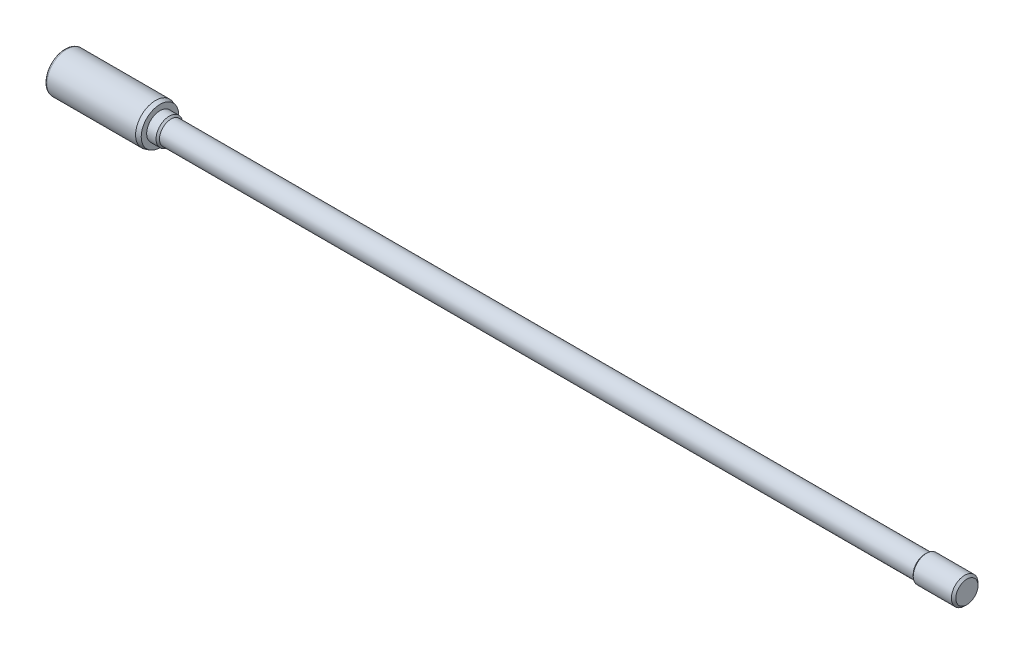
ISO-10303-21;
HEADER;
FILE_DESCRIPTION(('STEP AP214'),'2;1');
FILE_NAME('part.step','',(''),(''),'','','');
FILE_SCHEMA(('AUTOMOTIVE_DESIGN { 1 0 10303 214 1 1 1 1 }'));
ENDSEC;
DATA;
#1=APPLICATION_CONTEXT('core data for automotive mechanical design processes');
#2=APPLICATION_PROTOCOL_DEFINITION('international standard','automotive_design',2000,#1);
#3=PRODUCT_CONTEXT('',#1,'mechanical');
#4=PRODUCT('Part','Part','',(#3));
#5=PRODUCT_RELATED_PRODUCT_CATEGORY('part','',(#4));
#6=PRODUCT_DEFINITION_FORMATION('','',#4);
#7=PRODUCT_DEFINITION_CONTEXT('part definition',#1,'design');
#8=PRODUCT_DEFINITION('design','',#6,#7);
#9=PRODUCT_DEFINITION_SHAPE('','',#8);
#10=(LENGTH_UNIT() NAMED_UNIT(*) SI_UNIT(.MILLI.,.METRE.));
#11=(NAMED_UNIT(*) PLANE_ANGLE_UNIT() SI_UNIT($,.RADIAN.));
#12=(NAMED_UNIT(*) SI_UNIT($,.STERADIAN.) SOLID_ANGLE_UNIT());
#13=UNCERTAINTY_MEASURE_WITH_UNIT(LENGTH_MEASURE(1.E-05),#10,'distance_accuracy_value','');
#14=(GEOMETRIC_REPRESENTATION_CONTEXT(3) GLOBAL_UNCERTAINTY_ASSIGNED_CONTEXT((#13)) GLOBAL_UNIT_ASSIGNED_CONTEXT((#10,
#11,#12)) REPRESENTATION_CONTEXT('',''));
#15=CARTESIAN_POINT('',(0.,0.,0.));
#16=DIRECTION('',(0.,0.,1.));
#17=DIRECTION('',(1.,0.,0.));
#18=AXIS2_PLACEMENT_3D('',#15,#16,#17);
#19=CARTESIAN_POINT('',(4.5,18.5,-18.5));
#20=DIRECTION('',(1.,0.,0.));
#21=DIRECTION('',(0.,0.,-1.));
#22=AXIS2_PLACEMENT_3D('',#19,#20,#21);
#23=PLANE('',#22);
#24=DIRECTION('',(0.,1.,0.));
#25=VECTOR('',#24,1.);
#26=CARTESIAN_POINT('',(4.5,18.5,-21.5));
#27=LINE('',#26,#25);
#28=CARTESIAN_POINT('',(4.5,16.7679491924311,-21.5));
#29=VERTEX_POINT('',#28);
#30=CARTESIAN_POINT('',(4.49999999997521,18.5,-21.5000000000016));
#31=VERTEX_POINT('',#30);
#32=EDGE_CURVE('E83',#29,#31,#27,.T.);
#33=ORIENTED_EDGE('',*,*,#32,.F.);
#34=DIRECTION('',(0.,0.499999999999982,-0.866025403784449));
#35=VECTOR('',#34,1.);
#36=CARTESIAN_POINT('',(4.5,15.9019237886467,-20.));
#37=LINE('',#36,#35);
#38=CARTESIAN_POINT('',(4.49999999997521,15.9019237886453,-20.0000000000008));
#39=VERTEX_POINT('',#38);
#40=EDGE_CURVE('E106',#39,#29,#37,.T.);
#41=ORIENTED_EDGE('',*,*,#40,.F.);
#42=CARTESIAN_POINT('',(4.49999999995043,18.5,-18.5));
#43=DIRECTION('',(-1.,0.,0.));
#44=DIRECTION('',(0.,0.,1.));
#45=AXIS2_PLACEMENT_3D('',#42,#43,#44);
#46=CIRCLE('',#45,3.00000000000319);
#47=EDGE_CURVE('E112',#39,#31,#46,.F.);
#48=ORIENTED_EDGE('',*,*,#47,.T.);
#49=EDGE_LOOP('',(#33,#41,#48));
#50=FACE_BOUND('',#49,.T.);
#51=ADVANCED_FACE('F17',(#50),#23,.F.);
#52=CARTESIAN_POINT('',(4.5,18.5,-18.5));
#53=DIRECTION('',(1.,0.,0.));
#54=DIRECTION('',(0.,0.,-1.));
#55=AXIS2_PLACEMENT_3D('',#52,#53,#54);
#56=PLANE('',#55);
#57=DIRECTION('',(0.,0.499999999999983,0.866025403784448));
#58=VECTOR('',#57,1.);
#59=CARTESIAN_POINT('',(4.5,20.2320508075689,-21.5));
#60=LINE('',#59,#58);
#61=CARTESIAN_POINT('',(4.5,20.2320508075689,-21.5));
#62=VERTEX_POINT('',#61);
#63=CARTESIAN_POINT('',(4.49999999997521,21.0980762113547,-20.0000000000008));
#64=VERTEX_POINT('',#63);
#65=EDGE_CURVE('E120',#62,#64,#60,.T.);
#66=ORIENTED_EDGE('',*,*,#65,.F.);
#67=DIRECTION('',(0.,1.,0.));
#68=VECTOR('',#67,1.);
#69=CARTESIAN_POINT('',(4.5,18.5,-21.5));
#70=LINE('',#69,#68);
#71=EDGE_CURVE('E125',#31,#62,#70,.T.);
#72=ORIENTED_EDGE('',*,*,#71,.F.);
#73=CARTESIAN_POINT('',(4.49999999995043,18.5,-18.5));
#74=DIRECTION('',(-1.,0.,0.));
#75=DIRECTION('',(0.,0.,1.));
#76=AXIS2_PLACEMENT_3D('',#73,#74,#75);
#77=CIRCLE('',#76,3.00000000000319);
#78=EDGE_CURVE('E119',#31,#64,#77,.F.);
#79=ORIENTED_EDGE('',*,*,#78,.T.);
#80=EDGE_LOOP('',(#66,#72,#79));
#81=FACE_BOUND('',#80,.T.);
#82=ADVANCED_FACE('F573',(#81),#56,.F.);
#83=CARTESIAN_POINT('',(15.,19.75,-18.5));
#84=DIRECTION('',(-1.,0.,0.));
#85=DIRECTION('',(0.,0.,1.));
#86=AXIS2_PLACEMENT_3D('',#83,#84,#85);
#87=PLANE('',#86);
#88=CARTESIAN_POINT('',(15.,18.5,-18.5));
#89=DIRECTION('',(1.,0.,0.));
#90=DIRECTION('',(0.,0.,-1.));
#91=AXIS2_PLACEMENT_3D('',#88,#89,#90);
#92=CIRCLE('',#91,2.4585);
#93=CARTESIAN_POINT('',(15.,18.5,-20.9585));
#94=VERTEX_POINT('',#93);
#95=EDGE_CURVE('E257',#94,#94,#92,.F.);
#96=ORIENTED_EDGE('',*,*,#95,.T.);
#97=EDGE_LOOP('',(#96));
#98=FACE_BOUND('',#97,.T.);
#99=ADVANCED_FACE('F305',(#98),#87,.T.);
#100=CARTESIAN_POINT('',(4.5,18.5,-18.5));
#101=DIRECTION('',(1.,0.,0.));
#102=DIRECTION('',(0.,0.,-1.));
#103=AXIS2_PLACEMENT_3D('',#100,#101,#102);
#104=PLANE('',#103);
#105=DIRECTION('',(0.,-0.499999999999982,-0.866025403784449));
#106=VECTOR('',#105,1.);
#107=CARTESIAN_POINT('',(4.5,16.7679491924311,-15.5));
#108=LINE('',#107,#106);
#109=CARTESIAN_POINT('',(4.5,16.7679491924311,-15.5));
#110=VERTEX_POINT('',#109);
#111=CARTESIAN_POINT('',(4.49999999997521,15.9019237886453,-16.9999999999992));
#112=VERTEX_POINT('',#111);
#113=EDGE_CURVE('E255',#110,#112,#108,.T.);
#114=ORIENTED_EDGE('',*,*,#113,.F.);
#115=DIRECTION('',(0.,1.,0.));
#116=VECTOR('',#115,1.);
#117=CARTESIAN_POINT('',(4.5,18.5,-15.5));
#118=LINE('',#117,#116);
#119=CARTESIAN_POINT('',(4.49999999997521,18.5,-15.4999999999984));
#120=VERTEX_POINT('',#119);
#121=EDGE_CURVE('E122',#120,#110,#118,.F.);
#122=ORIENTED_EDGE('',*,*,#121,.F.);
#123=CARTESIAN_POINT('',(4.49999999995043,18.5,-18.5));
#124=DIRECTION('',(-1.,0.,0.));
#125=DIRECTION('',(0.,0.,1.));
#126=AXIS2_PLACEMENT_3D('',#123,#124,#125);
#127=CIRCLE('',#126,3.00000000000319);
#128=EDGE_CURVE('E99',#120,#112,#127,.F.);
#129=ORIENTED_EDGE('',*,*,#128,.T.);
#130=EDGE_LOOP('',(#114,#122,#129));
#131=FACE_BOUND('',#130,.T.);
#132=ADVANCED_FACE('F310',(#131),#104,.F.);
#133=CARTESIAN_POINT('',(13.25,18.5,-18.5));
#134=DIRECTION('',(1.,0.,0.));
#135=DIRECTION('',(0.,0.,-1.));
#136=AXIS2_PLACEMENT_3D('',#133,#134,#135);
#137=CYLINDRICAL_SURFACE('',#136,2.4585);
#138=ORIENTED_EDGE('',*,*,#95,.F.);
#139=EDGE_LOOP('',(#138));
#140=FACE_BOUND('',#139,.T.);
#141=CARTESIAN_POINT('',(5.04149999994752,18.5,-18.5));
#142=DIRECTION('',(-1.,0.,0.));
#143=DIRECTION('',(0.,1.,0.));
#144=AXIS2_PLACEMENT_3D('',#141,#142,#143);
#145=CIRCLE('',#144,2.45849999994925);
#146=CARTESIAN_POINT('',(5.04149999994752,20.9584999999493,-18.5));
#147=VERTEX_POINT('',#146);
#148=EDGE_CURVE('E98',#147,#147,#145,.T.);
#149=ORIENTED_EDGE('',*,*,#148,.T.);
#150=EDGE_LOOP('',(#149));
#151=FACE_BOUND('',#150,.T.);
#152=ADVANCED_FACE('F307',(#140,#151),#137,.F.);
#153=CARTESIAN_POINT('',(4.50000000006412,18.5,-18.5));
#154=DIRECTION('',(-1.,0.,0.));
#155=DIRECTION('',(0.,0.,1.));
#156=AXIS2_PLACEMENT_3D('',#153,#154,#155);
#157=CONICAL_SURFACE('',#156,2.9999999998895,0.785398163397448);
#158=ORIENTED_EDGE('',*,*,#47,.F.);
#159=CARTESIAN_POINT('',(4.49999999995043,18.5,-18.5));
#160=DIRECTION('',(-1.,0.,0.));
#161=DIRECTION('',(0.,0.,1.));
#162=AXIS2_PLACEMENT_3D('',#159,#160,#161);
#163=CIRCLE('',#162,3.00000000000319);
#164=EDGE_CURVE('E89',#112,#39,#163,.F.);
#165=ORIENTED_EDGE('',*,*,#164,.F.);
#166=ORIENTED_EDGE('',*,*,#128,.F.);
#167=CARTESIAN_POINT('',(4.49999999995043,18.5,-18.5));
#168=DIRECTION('',(-1.,0.,0.));
#169=DIRECTION('',(0.,0.,1.));
#170=AXIS2_PLACEMENT_3D('',#167,#168,#169);
#171=CIRCLE('',#170,3.00000000000319);
#172=CARTESIAN_POINT('',(4.49999999997521,21.0980762113547,-16.9999999999992));
#173=VERTEX_POINT('',#172);
#174=EDGE_CURVE('E221',#120,#173,#171,.T.);
#175=ORIENTED_EDGE('',*,*,#174,.T.);
#176=CARTESIAN_POINT('',(4.49999999995043,18.5,-18.5));
#177=DIRECTION('',(-1.,0.,0.));
#178=DIRECTION('',(0.,0.,1.));
#179=AXIS2_PLACEMENT_3D('',#176,#177,#178);
#180=CIRCLE('',#179,3.00000000000319);
#181=EDGE_CURVE('E301',#64,#173,#180,.F.);
#182=ORIENTED_EDGE('',*,*,#181,.F.);
#183=ORIENTED_EDGE('',*,*,#78,.F.);
#184=EDGE_LOOP('',(#158,#165,#166,#175,#182,#183));
#185=FACE_BOUND('',#184,.T.);
#186=ORIENTED_EDGE('',*,*,#148,.F.);
#187=EDGE_LOOP('',(#186));
#188=FACE_BOUND('',#187,.T.);
#189=ADVANCED_FACE('F116',(#185,#188),#157,.F.);
#190=CARTESIAN_POINT('',(4.5,18.5,-18.5));
#191=DIRECTION('',(1.,0.,0.));
#192=DIRECTION('',(0.,0.,-1.));
#193=AXIS2_PLACEMENT_3D('',#190,#191,#192);
#194=PLANE('',#193);
#195=DIRECTION('',(0.,1.,0.));
#196=VECTOR('',#195,1.);
#197=CARTESIAN_POINT('',(4.5,16.7679491924311,-15.5));
#198=LINE('',#197,#196);
#199=CARTESIAN_POINT('',(4.5,20.2320508075689,-15.5));
#200=VERTEX_POINT('',#199);
#201=EDGE_CURVE('E242',#120,#200,#198,.T.);
#202=ORIENTED_EDGE('',*,*,#201,.T.);
#203=DIRECTION('',(0.,-0.5,0.866025403784436));
#204=VECTOR('',#203,1.);
#205=CARTESIAN_POINT('',(4.5,20.2320508075689,-15.5));
#206=LINE('',#205,#204);
#207=EDGE_CURVE('E220',#200,#173,#206,.F.);
#208=ORIENTED_EDGE('',*,*,#207,.T.);
#209=ORIENTED_EDGE('',*,*,#174,.F.);
#210=EDGE_LOOP('',(#202,#208,#209));
#211=FACE_BOUND('',#210,.T.);
#212=ADVANCED_FACE('F314',(#211),#194,.F.);
#213=CARTESIAN_POINT('',(4.5,18.5,-18.5));
#214=DIRECTION('',(1.,0.,0.));
#215=DIRECTION('',(0.,0.,-1.));
#216=AXIS2_PLACEMENT_3D('',#213,#214,#215);
#217=PLANE('',#216);
#218=ORIENTED_EDGE('',*,*,#164,.T.);
#219=DIRECTION('',(0.,0.5,-0.866025403784436));
#220=VECTOR('',#219,1.);
#221=CARTESIAN_POINT('',(4.5,16.7679491924311,-21.5));
#222=LINE('',#221,#220);
#223=CARTESIAN_POINT('',(4.5,15.0358983848622,-18.5));
#224=VERTEX_POINT('',#223);
#225=EDGE_CURVE('E92',#39,#224,#222,.F.);
#226=ORIENTED_EDGE('',*,*,#225,.T.);
#227=DIRECTION('',(0.,-0.5,-0.866025403784436));
#228=VECTOR('',#227,1.);
#229=CARTESIAN_POINT('',(4.5,15.0358983848622,-18.5));
#230=LINE('',#229,#228);
#231=EDGE_CURVE('E94',#224,#112,#230,.F.);
#232=ORIENTED_EDGE('',*,*,#231,.T.);
#233=EDGE_LOOP('',(#218,#226,#232));
#234=FACE_BOUND('',#233,.T.);
#235=ADVANCED_FACE('F91',(#234),#217,.F.);
#236=CARTESIAN_POINT('',(4.5,18.5,-18.5));
#237=DIRECTION('',(1.,0.,0.));
#238=DIRECTION('',(0.,0.,-1.));
#239=AXIS2_PLACEMENT_3D('',#236,#237,#238);
#240=PLANE('',#239);
#241=ORIENTED_EDGE('',*,*,#181,.T.);
#242=DIRECTION('',(0.,-0.5,0.866025403784436));
#243=VECTOR('',#242,1.);
#244=CARTESIAN_POINT('',(4.5,20.2320508075689,-15.5));
#245=LINE('',#244,#243);
#246=CARTESIAN_POINT('',(4.5,21.9641016151378,-18.5));
#247=VERTEX_POINT('',#246);
#248=EDGE_CURVE('E218',#173,#247,#245,.F.);
#249=ORIENTED_EDGE('',*,*,#248,.T.);
#250=DIRECTION('',(0.,0.5,0.866025403784436));
#251=VECTOR('',#250,1.);
#252=CARTESIAN_POINT('',(4.5,21.9641016151378,-18.5));
#253=LINE('',#252,#251);
#254=EDGE_CURVE('E202',#247,#64,#253,.F.);
#255=ORIENTED_EDGE('',*,*,#254,.T.);
#256=EDGE_LOOP('',(#241,#249,#255));
#257=FACE_BOUND('',#256,.T.);
#258=ADVANCED_FACE('F464',(#257),#240,.F.);
#259=CARTESIAN_POINT('',(0.5,20.2320508075689,-15.5));
#260=DIRECTION('',(0.,0.866025403784436,0.5));
#261=DIRECTION('',(0.,-0.5,0.866025403784436));
#262=AXIS2_PLACEMENT_3D('',#259,#260,#261);
#263=PLANE('',#262);
#264=DIRECTION('',(1.,0.,0.));
#265=VECTOR('',#264,1.);
#266=CARTESIAN_POINT('',(0.5,20.2320508075689,-15.5));
#267=LINE('',#266,#265);
#268=CARTESIAN_POINT('',(0.5,20.2320508075689,-15.5));
#269=VERTEX_POINT('',#268);
#270=EDGE_CURVE('E244',#200,#269,#267,.F.);
#271=ORIENTED_EDGE('',*,*,#270,.T.);
#272=DIRECTION('',(0.,-0.500000000000006,0.866025403784435));
#273=VECTOR('',#272,1.);
#274=CARTESIAN_POINT('',(0.5,21.9641016151378,-18.5));
#275=LINE('',#274,#273);
#276=CARTESIAN_POINT('',(0.5,21.9641016151378,-18.5));
#277=VERTEX_POINT('',#276);
#278=EDGE_CURVE('E198',#277,#269,#275,.T.);
#279=ORIENTED_EDGE('',*,*,#278,.F.);
#280=DIRECTION('',(1.,0.,0.));
#281=VECTOR('',#280,1.);
#282=CARTESIAN_POINT('',(0.5,21.9641016151378,-18.5));
#283=LINE('',#282,#281);
#284=EDGE_CURVE('E210',#277,#247,#283,.T.);
#285=ORIENTED_EDGE('',*,*,#284,.T.);
#286=ORIENTED_EDGE('',*,*,#248,.F.);
#287=ORIENTED_EDGE('',*,*,#207,.F.);
#288=EDGE_LOOP('',(#271,#279,#285,#286,#287));
#289=FACE_BOUND('',#288,.T.);
#290=ADVANCED_FACE('F455',(#289),#263,.F.);
#291=CARTESIAN_POINT('',(0.5,16.7679491924311,-15.5));
#292=DIRECTION('',(0.,0.,1.));
#293=DIRECTION('',(1.,0.,0.));
#294=AXIS2_PLACEMENT_3D('',#291,#292,#293);
#295=PLANE('',#294);
#296=DIRECTION('',(1.,0.,0.));
#297=VECTOR('',#296,1.);
#298=CARTESIAN_POINT('',(0.5,16.7679491924311,-15.5));
#299=LINE('',#298,#297);
#300=CARTESIAN_POINT('',(0.5,16.7679491924311,-15.5));
#301=VERTEX_POINT('',#300);
#302=EDGE_CURVE('E235',#110,#301,#299,.F.);
#303=ORIENTED_EDGE('',*,*,#302,.T.);
#304=DIRECTION('',(0.,1.,0.));
#305=VECTOR('',#304,1.);
#306=CARTESIAN_POINT('',(0.5,20.5,-15.5));
#307=LINE('',#306,#305);
#308=EDGE_CURVE('E195',#269,#301,#307,.F.);
#309=ORIENTED_EDGE('',*,*,#308,.F.);
#310=ORIENTED_EDGE('',*,*,#270,.F.);
#311=ORIENTED_EDGE('',*,*,#201,.F.);
#312=ORIENTED_EDGE('',*,*,#121,.T.);
#313=EDGE_LOOP('',(#303,#309,#310,#311,#312));
#314=FACE_BOUND('',#313,.T.);
#315=ADVANCED_FACE('F446',(#314),#295,.F.);
#316=CARTESIAN_POINT('',(0.5,15.0358983848622,-18.5));
#317=DIRECTION('',(0.,-0.866025403784436,0.5));
#318=DIRECTION('',(0.,-0.5,-0.866025403784436));
#319=AXIS2_PLACEMENT_3D('',#316,#317,#318);
#320=PLANE('',#319);
#321=DIRECTION('',(1.,0.,0.));
#322=VECTOR('',#321,1.);
#323=CARTESIAN_POINT('',(0.5,15.0358983848622,-18.5));
#324=LINE('',#323,#322);
#325=CARTESIAN_POINT('',(0.5,15.0358983848622,-18.5));
#326=VERTEX_POINT('',#325);
#327=EDGE_CURVE('E109',#224,#326,#324,.F.);
#328=ORIENTED_EDGE('',*,*,#327,.T.);
#329=DIRECTION('',(0.,-0.5,-0.866025403784436));
#330=VECTOR('',#329,1.);
#331=CARTESIAN_POINT('',(0.5,16.7679491924311,-15.5));
#332=LINE('',#331,#330);
#333=EDGE_CURVE('E192',#301,#326,#332,.T.);
#334=ORIENTED_EDGE('',*,*,#333,.F.);
#335=ORIENTED_EDGE('',*,*,#302,.F.);
#336=ORIENTED_EDGE('',*,*,#113,.T.);
#337=ORIENTED_EDGE('',*,*,#231,.F.);
#338=EDGE_LOOP('',(#328,#334,#335,#336,#337));
#339=FACE_BOUND('',#338,.T.);
#340=ADVANCED_FACE('F438',(#339),#320,.F.);
#341=CARTESIAN_POINT('',(0.5,16.7679491924311,-21.5));
#342=DIRECTION('',(0.,-0.866025403784436,-0.5));
#343=DIRECTION('',(0.,0.5,-0.866025403784436));
#344=AXIS2_PLACEMENT_3D('',#341,#342,#343);
#345=PLANE('',#344);
#346=DIRECTION('',(-1.,0.,0.));
#347=VECTOR('',#346,1.);
#348=CARTESIAN_POINT('',(0.5,16.7679491924311,-21.5));
#349=LINE('',#348,#347);
#350=CARTESIAN_POINT('',(0.5,16.7679491924311,-21.5));
#351=VERTEX_POINT('',#350);
#352=EDGE_CURVE('E239',#29,#351,#349,.T.);
#353=ORIENTED_EDGE('',*,*,#352,.T.);
#354=DIRECTION('',(0.,0.5,-0.866025403784436));
#355=VECTOR('',#354,1.);
#356=CARTESIAN_POINT('',(0.5,15.0358983848622,-18.5));
#357=LINE('',#356,#355);
#358=EDGE_CURVE('E189',#326,#351,#357,.T.);
#359=ORIENTED_EDGE('',*,*,#358,.F.);
#360=ORIENTED_EDGE('',*,*,#327,.F.);
#361=ORIENTED_EDGE('',*,*,#225,.F.);
#362=ORIENTED_EDGE('',*,*,#40,.T.);
#363=EDGE_LOOP('',(#353,#359,#360,#361,#362));
#364=FACE_BOUND('',#363,.T.);
#365=ADVANCED_FACE('F105',(#364),#345,.F.);
#366=CARTESIAN_POINT('',(0.5,20.2320508075689,-21.5));
#367=DIRECTION('',(0.,0.,-1.));
#368=DIRECTION('',(-1.,0.,0.));
#369=AXIS2_PLACEMENT_3D('',#366,#367,#368);
#370=PLANE('',#369);
#371=DIRECTION('',(1.,0.,0.));
#372=VECTOR('',#371,1.);
#373=CARTESIAN_POINT('',(0.5,20.2320508075689,-21.5));
#374=LINE('',#373,#372);
#375=CARTESIAN_POINT('',(0.5,20.2320508075689,-21.5));
#376=VERTEX_POINT('',#375);
#377=EDGE_CURVE('E215',#62,#376,#374,.F.);
#378=ORIENTED_EDGE('',*,*,#377,.T.);
#379=DIRECTION('',(0.,1.,0.));
#380=VECTOR('',#379,1.);
#381=CARTESIAN_POINT('',(0.5,20.5,-21.5));
#382=LINE('',#381,#380);
#383=EDGE_CURVE('E180',#351,#376,#382,.T.);
#384=ORIENTED_EDGE('',*,*,#383,.F.);
#385=ORIENTED_EDGE('',*,*,#352,.F.);
#386=ORIENTED_EDGE('',*,*,#32,.T.);
#387=ORIENTED_EDGE('',*,*,#71,.T.);
#388=EDGE_LOOP('',(#378,#384,#385,#386,#387));
#389=FACE_BOUND('',#388,.T.);
#390=ADVANCED_FACE('F423',(#389),#370,.F.);
#391=CARTESIAN_POINT('',(0.5,21.9641016151378,-18.5));
#392=DIRECTION('',(0.,0.866025403784436,-0.5));
#393=DIRECTION('',(0.,0.5,0.866025403784436));
#394=AXIS2_PLACEMENT_3D('',#391,#392,#393);
#395=PLANE('',#394);
#396=ORIENTED_EDGE('',*,*,#284,.F.);
#397=DIRECTION('',(0.,0.5,0.866025403784436));
#398=VECTOR('',#397,1.);
#399=CARTESIAN_POINT('',(0.5,20.2320508075689,-21.5));
#400=LINE('',#399,#398);
#401=EDGE_CURVE('E188',#376,#277,#400,.T.);
#402=ORIENTED_EDGE('',*,*,#401,.F.);
#403=ORIENTED_EDGE('',*,*,#377,.F.);
#404=ORIENTED_EDGE('',*,*,#65,.T.);
#405=ORIENTED_EDGE('',*,*,#254,.F.);
#406=EDGE_LOOP('',(#396,#402,#403,#404,#405));
#407=FACE_BOUND('',#406,.T.);
#408=ADVANCED_FACE('F416',(#407),#395,.F.);
#409=CARTESIAN_POINT('',(0.5,20.5,-18.5));
#410=DIRECTION('',(-1.,0.,0.));
#411=DIRECTION('',(0.,0.,1.));
#412=AXIS2_PLACEMENT_3D('',#409,#410,#411);
#413=PLANE('',#412);
#414=CARTESIAN_POINT('',(0.499999999999997,18.5,-18.5));
#415=DIRECTION('',(1.,0.,0.));
#416=DIRECTION('',(0.,0.,1.));
#417=AXIS2_PLACEMENT_3D('',#414,#415,#416);
#418=CIRCLE('',#417,4.);
#419=CARTESIAN_POINT('',(0.5,18.5,-14.5));
#420=VERTEX_POINT('',#419);
#421=CARTESIAN_POINT('',(0.5,18.5,-22.5));
#422=VERTEX_POINT('',#421);
#423=EDGE_CURVE('E166',#420,#422,#418,.T.);
#424=ORIENTED_EDGE('',*,*,#423,.F.);
#425=CARTESIAN_POINT('',(0.499999999999997,18.5,-18.5));
#426=DIRECTION('',(1.,0.,0.));
#427=DIRECTION('',(0.,1.,0.));
#428=AXIS2_PLACEMENT_3D('',#425,#426,#427);
#429=CIRCLE('',#428,4.);
#430=CARTESIAN_POINT('',(0.5,22.5,-18.5));
#431=VERTEX_POINT('',#430);
#432=EDGE_CURVE('E176',#431,#420,#429,.T.);
#433=ORIENTED_EDGE('',*,*,#432,.F.);
#434=CARTESIAN_POINT('',(0.499999999999997,18.5,-18.5));
#435=DIRECTION('',(1.,0.,0.));
#436=DIRECTION('',(0.,0.,-1.));
#437=AXIS2_PLACEMENT_3D('',#434,#435,#436);
#438=CIRCLE('',#437,4.);
#439=EDGE_CURVE('E37',#422,#431,#438,.T.);
#440=ORIENTED_EDGE('',*,*,#439,.F.);
#441=EDGE_LOOP('',(#424,#433,#440));
#442=FACE_BOUND('',#441,.T.);
#443=ORIENTED_EDGE('',*,*,#383,.T.);
#444=ORIENTED_EDGE('',*,*,#401,.T.);
#445=ORIENTED_EDGE('',*,*,#278,.T.);
#446=ORIENTED_EDGE('',*,*,#308,.T.);
#447=ORIENTED_EDGE('',*,*,#333,.T.);
#448=ORIENTED_EDGE('',*,*,#358,.T.);
#449=EDGE_LOOP('',(#443,#444,#445,#446,#447,#448));
#450=FACE_BOUND('',#449,.T.);
#451=ADVANCED_FACE('F145',(#442,#450),#413,.T.);
#452=CARTESIAN_POINT('',(1.00000000000042,18.5,-18.5));
#453=DIRECTION('',(-1.,0.,0.));
#454=DIRECTION('',(0.,0.,1.));
#455=AXIS2_PLACEMENT_3D('',#452,#453,#454);
#456=TOROIDAL_SURFACE('',#455,3.99999999999958,0.500000000000423);
#457=ORIENTED_EDGE('',*,*,#432,.T.);
#458=ORIENTED_EDGE('',*,*,#423,.T.);
#459=ORIENTED_EDGE('',*,*,#439,.T.);
#460=EDGE_LOOP('',(#457,#458,#459));
#461=FACE_BOUND('',#460,.T.);
#462=CARTESIAN_POINT('',(1.,18.5,-18.5));
#463=DIRECTION('',(1.,0.,0.));
#464=DIRECTION('',(0.,0.,-1.));
#465=AXIS2_PLACEMENT_3D('',#462,#463,#464);
#466=CIRCLE('',#465,4.5);
#467=CARTESIAN_POINT('',(1.,18.5,-23.));
#468=VERTEX_POINT('',#467);
#469=EDGE_CURVE('E154',#468,#468,#466,.T.);
#470=ORIENTED_EDGE('',*,*,#469,.F.);
#471=EDGE_LOOP('',(#470));
#472=FACE_BOUND('',#471,.T.);
#473=ADVANCED_FACE('F133',(#461,#472),#456,.T.);
#474=CARTESIAN_POINT('',(11.,18.5,-18.5));
#475=DIRECTION('',(1.,0.,0.));
#476=DIRECTION('',(0.,0.,-1.));
#477=AXIS2_PLACEMENT_3D('',#474,#475,#476);
#478=CYLINDRICAL_SURFACE('',#477,4.5);
#479=ORIENTED_EDGE('',*,*,#469,.T.);
#480=EDGE_LOOP('',(#479));
#481=FACE_BOUND('',#480,.T.);
#482=CARTESIAN_POINT('',(20.9999999999581,18.5,-18.5));
#483=DIRECTION('',(-1.,0.,0.));
#484=DIRECTION('',(0.,1.,0.));
#485=AXIS2_PLACEMENT_3D('',#482,#483,#484);
#486=CIRCLE('',#485,4.49999999996771);
#487=CARTESIAN_POINT('',(20.9999999999581,22.9999999999677,-18.5));
#488=VERTEX_POINT('',#487);
#489=EDGE_CURVE('E296',#488,#488,#486,.F.);
#490=ORIENTED_EDGE('',*,*,#489,.F.);
#491=EDGE_LOOP('',(#490));
#492=FACE_BOUND('',#491,.T.);
#493=ADVANCED_FACE('F144',(#481,#492),#478,.T.);
#494=CARTESIAN_POINT('',(20.9999999999581,18.5,-18.5));
#495=DIRECTION('',(-1.,0.,0.));
#496=DIRECTION('',(0.,0.,1.));
#497=AXIS2_PLACEMENT_3D('',#494,#495,#496);
#498=CONICAL_SURFACE('',#497,4.49999999996771,0.261799387780279);
#499=ORIENTED_EDGE('',*,*,#489,.T.);
#500=EDGE_LOOP('',(#499));
#501=FACE_BOUND('',#500,.T.);
#502=CARTESIAN_POINT('',(21.9999999999913,18.5,-18.5));
#503=DIRECTION('',(-1.,0.,0.));
#504=DIRECTION('',(0.,0.,1.));
#505=AXIS2_PLACEMENT_3D('',#502,#503,#504);
#506=CIRCLE('',#505,4.23205080754792);
#507=CARTESIAN_POINT('',(21.9999999999913,18.5,-14.2679491924521));
#508=VERTEX_POINT('',#507);
#509=EDGE_CURVE('E293',#508,#508,#506,.F.);
#510=ORIENTED_EDGE('',*,*,#509,.F.);
#511=EDGE_LOOP('',(#510));
#512=FACE_BOUND('',#511,.T.);
#513=ADVANCED_FACE('F359',(#501,#512),#498,.T.);
#514=CARTESIAN_POINT('',(204.,19.75,-18.5));
#515=DIRECTION('',(1.,0.,0.));
#516=DIRECTION('',(0.,0.,-1.));
#517=AXIS2_PLACEMENT_3D('',#514,#515,#516);
#518=PLANE('',#517);
#519=CARTESIAN_POINT('',(204.000000000007,18.5,-18.5));
#520=DIRECTION('',(-1.,0.,0.));
#521=DIRECTION('',(0.,0.,1.));
#522=AXIS2_PLACEMENT_3D('',#519,#520,#521);
#523=CIRCLE('',#522,2.49999999995817);
#524=CARTESIAN_POINT('',(204.000000000007,18.5,-16.0000000000418));
#525=VERTEX_POINT('',#524);
#526=EDGE_CURVE('E290',#525,#525,#523,.T.);
#527=ORIENTED_EDGE('',*,*,#526,.F.);
#528=EDGE_LOOP('',(#527));
#529=FACE_BOUND('',#528,.T.);
#530=ADVANCED_FACE('F356',(#529),#518,.T.);
#531=CARTESIAN_POINT('',(22.,20.6160254037844,-18.5));
#532=DIRECTION('',(1.,0.,0.));
#533=DIRECTION('',(0.,0.,-1.));
#534=AXIS2_PLACEMENT_3D('',#531,#532,#533);
#535=PLANE('',#534);
#536=ORIENTED_EDGE('',*,*,#509,.T.);
#537=EDGE_LOOP('',(#536));
#538=FACE_BOUND('',#537,.T.);
#539=CARTESIAN_POINT('',(22.,18.5,-18.5));
#540=DIRECTION('',(1.,0.,0.));
#541=DIRECTION('',(0.,0.,-1.));
#542=AXIS2_PLACEMENT_3D('',#539,#540,#541);
#543=CIRCLE('',#542,3.);
#544=CARTESIAN_POINT('',(22.,18.5,-21.5));
#545=VERTEX_POINT('',#544);
#546=EDGE_CURVE('E286',#545,#545,#543,.T.);
#547=ORIENTED_EDGE('',*,*,#546,.F.);
#548=EDGE_LOOP('',(#547));
#549=FACE_BOUND('',#548,.T.);
#550=ADVANCED_FACE('F352',(#538,#549),#535,.T.);
#551=CARTESIAN_POINT('',(203.499999999963,18.5,-18.5));
#552=DIRECTION('',(-1.,0.,0.));
#553=DIRECTION('',(0.,0.,1.));
#554=AXIS2_PLACEMENT_3D('',#551,#552,#553);
#555=CONICAL_SURFACE('',#554,3.00000000000319,0.785398163397448);
#556=ORIENTED_EDGE('',*,*,#526,.T.);
#557=EDGE_LOOP('',(#556));
#558=FACE_BOUND('',#557,.T.);
#559=CARTESIAN_POINT('',(203.5,18.5,-18.5));
#560=DIRECTION('',(1.,0.,0.));
#561=DIRECTION('',(0.,0.,-1.));
#562=AXIS2_PLACEMENT_3D('',#559,#560,#561);
#563=CIRCLE('',#562,3.);
#564=CARTESIAN_POINT('',(203.5,18.5,-21.5));
#565=VERTEX_POINT('',#564);
#566=EDGE_CURVE('E289',#565,#565,#563,.F.);
#567=ORIENTED_EDGE('',*,*,#566,.F.);
#568=EDGE_LOOP('',(#567));
#569=FACE_BOUND('',#568,.T.);
#570=ADVANCED_FACE('F348',(#558,#569),#555,.T.);
#571=CARTESIAN_POINT('',(19.805,18.5,-18.5));
#572=DIRECTION('',(1.,0.,0.));
#573=DIRECTION('',(0.,0.,-1.));
#574=AXIS2_PLACEMENT_3D('',#571,#572,#573);
#575=CYLINDRICAL_SURFACE('',#574,3.);
#576=ORIENTED_EDGE('',*,*,#546,.T.);
#577=EDGE_LOOP('',(#576));
#578=FACE_BOUND('',#577,.T.);
#579=CARTESIAN_POINT('',(24.1100000000643,18.5,-18.5));
#580=DIRECTION('',(-1.,0.,0.));
#581=DIRECTION('',(0.,1.,0.));
#582=AXIS2_PLACEMENT_3D('',#579,#580,#581);
#583=CIRCLE('',#582,2.99999999994634);
#584=CARTESIAN_POINT('',(24.1100000000643,21.4999999999463,-18.5));
#585=VERTEX_POINT('',#584);
#586=EDGE_CURVE('E377',#585,#585,#583,.F.);
#587=ORIENTED_EDGE('',*,*,#586,.F.);
#588=EDGE_LOOP('',(#587));
#589=FACE_BOUND('',#588,.T.);
#590=ADVANCED_FACE('F344',(#578,#589),#575,.T.);
#591=CARTESIAN_POINT('',(199.195,18.5,-18.5));
#592=DIRECTION('',(1.,0.,0.));
#593=DIRECTION('',(0.,0.,-1.));
#594=AXIS2_PLACEMENT_3D('',#591,#592,#593);
#595=CYLINDRICAL_SURFACE('',#594,3.);
#596=CARTESIAN_POINT('',(194.889999999986,18.5,-18.5));
#597=DIRECTION('',(1.,0.,0.));
#598=DIRECTION('',(0.,1.,0.));
#599=AXIS2_PLACEMENT_3D('',#596,#597,#598);
#600=CIRCLE('',#599,3.00000000000319);
#601=CARTESIAN_POINT('',(194.889999999986,21.5000000000032,-18.5));
#602=VERTEX_POINT('',#601);
#603=EDGE_CURVE('E378',#602,#602,#600,.F.);
#604=ORIENTED_EDGE('',*,*,#603,.F.);
#605=EDGE_LOOP('',(#604));
#606=FACE_BOUND('',#605,.T.);
#607=ORIENTED_EDGE('',*,*,#566,.T.);
#608=EDGE_LOOP('',(#607));
#609=FACE_BOUND('',#608,.T.);
#610=ADVANCED_FACE('F340',(#606,#609),#595,.T.);
#611=CARTESIAN_POINT('',(24.1100000001211,18.5,-18.5));
#612=DIRECTION('',(-1.,0.,0.));
#613=DIRECTION('',(0.,0.,1.));
#614=AXIS2_PLACEMENT_3D('',#611,#612,#613);
#615=CONICAL_SURFACE('',#614,2.9999999998895,0.785398163397448);
#616=ORIENTED_EDGE('',*,*,#586,.T.);
#617=EDGE_LOOP('',(#616));
#618=FACE_BOUND('',#617,.T.);
#619=CARTESIAN_POINT('',(24.5,18.5,-18.5));
#620=DIRECTION('',(1.,0.,0.));
#621=DIRECTION('',(0.,0.,-1.));
#622=AXIS2_PLACEMENT_3D('',#619,#620,#621);
#623=CIRCLE('',#622,2.61);
#624=CARTESIAN_POINT('',(24.5,18.5,-21.11));
#625=VERTEX_POINT('',#624);
#626=EDGE_CURVE('E28',#625,#625,#623,.T.);
#627=ORIENTED_EDGE('',*,*,#626,.F.);
#628=EDGE_LOOP('',(#627));
#629=FACE_BOUND('',#628,.T.);
#630=ADVANCED_FACE('F332',(#618,#629),#615,.T.);
#631=CARTESIAN_POINT('',(194.889999999873,18.5,-18.5));
#632=DIRECTION('',(1.,0.,0.));
#633=DIRECTION('',(0.,0.,-1.));
#634=AXIS2_PLACEMENT_3D('',#631,#632,#633);
#635=CONICAL_SURFACE('',#634,2.9999999998895,0.785398163397448);
#636=ORIENTED_EDGE('',*,*,#603,.T.);
#637=EDGE_LOOP('',(#636));
#638=FACE_BOUND('',#637,.T.);
#639=CARTESIAN_POINT('',(194.5,18.5,-18.5));
#640=DIRECTION('',(1.,0.,0.));
#641=DIRECTION('',(0.,0.,-1.));
#642=AXIS2_PLACEMENT_3D('',#639,#640,#641);
#643=CIRCLE('',#642,2.61);
#644=CARTESIAN_POINT('',(194.5,18.5,-21.11));
#645=VERTEX_POINT('',#644);
#646=EDGE_CURVE('E11',#645,#645,#643,.F.);
#647=ORIENTED_EDGE('',*,*,#646,.F.);
#648=EDGE_LOOP('',(#647));
#649=FACE_BOUND('',#648,.T.);
#650=ADVANCED_FACE('F325',(#638,#649),#635,.T.);
#651=CARTESIAN_POINT('',(109.5,18.5,-18.5));
#652=DIRECTION('',(1.,0.,0.));
#653=DIRECTION('',(0.,0.,-1.));
#654=AXIS2_PLACEMENT_3D('',#651,#652,#653);
#655=CYLINDRICAL_SURFACE('',#654,2.61);
#656=ORIENTED_EDGE('',*,*,#626,.T.);
#657=EDGE_LOOP('',(#656));
#658=FACE_BOUND('',#657,.T.);
#659=ORIENTED_EDGE('',*,*,#646,.T.);
#660=EDGE_LOOP('',(#659));
#661=FACE_BOUND('',#660,.T.);
#662=ADVANCED_FACE('F323',(#658,#661),#655,.T.);
#663=CLOSED_SHELL('',(#51,#82,#99,#132,#152,#189,#212,#235,#258,#290,#315,#340,#365,#390,#408,
#451,#473,#493,#513,#530,#550,#570,#590,#610,#630,#650,#662));
#664=MANIFOLD_SOLID_BREP('B1',#663);
#665=ADVANCED_BREP_SHAPE_REPRESENTATION('',(#18,#664),#14);
#666=SHAPE_DEFINITION_REPRESENTATION(#9,#665);
ENDSEC;
END-ISO-10303-21;
